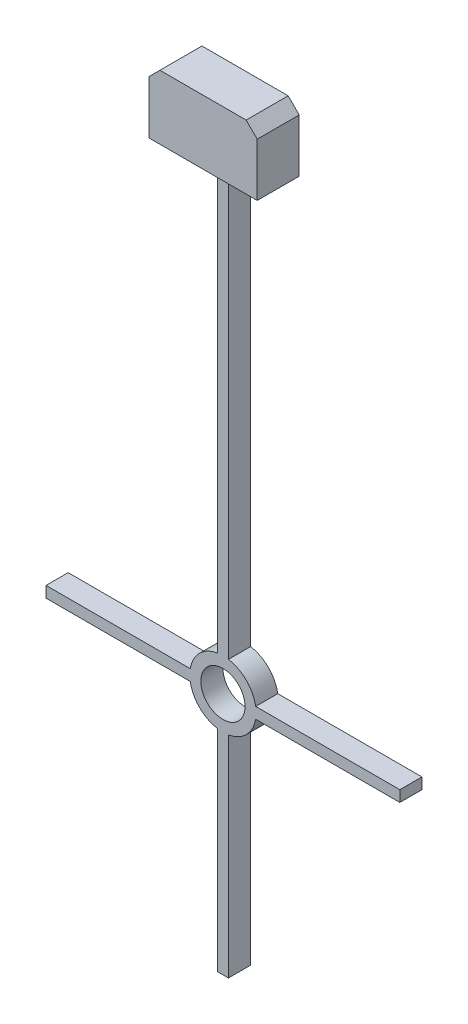
ISO-10303-21;
HEADER;
FILE_DESCRIPTION(('STEP AP214'),'2;1');
FILE_NAME('part.step','',(''),(''),'','','');
FILE_SCHEMA(('AUTOMOTIVE_DESIGN { 1 0 10303 214 1 1 1 1 }'));
ENDSEC;
DATA;
#1=APPLICATION_CONTEXT('core data for automotive mechanical design processes');
#2=APPLICATION_PROTOCOL_DEFINITION('international standard','automotive_design',2000,#1);
#3=PRODUCT_CONTEXT('',#1,'mechanical');
#4=PRODUCT('Part','Part','',(#3));
#5=PRODUCT_RELATED_PRODUCT_CATEGORY('part','',(#4));
#6=PRODUCT_DEFINITION_FORMATION('','',#4);
#7=PRODUCT_DEFINITION_CONTEXT('part definition',#1,'design');
#8=PRODUCT_DEFINITION('design','',#6,#7);
#9=PRODUCT_DEFINITION_SHAPE('','',#8);
#10=(LENGTH_UNIT() NAMED_UNIT(*) SI_UNIT(.MILLI.,.METRE.));
#11=(NAMED_UNIT(*) PLANE_ANGLE_UNIT() SI_UNIT($,.RADIAN.));
#12=(NAMED_UNIT(*) SI_UNIT($,.STERADIAN.) SOLID_ANGLE_UNIT());
#13=UNCERTAINTY_MEASURE_WITH_UNIT(LENGTH_MEASURE(1.E-05),#10,'distance_accuracy_value','');
#14=(GEOMETRIC_REPRESENTATION_CONTEXT(3) GLOBAL_UNCERTAINTY_ASSIGNED_CONTEXT((#13)) GLOBAL_UNIT_ASSIGNED_CONTEXT((#10,
#11,#12)) REPRESENTATION_CONTEXT('',''));
#15=CARTESIAN_POINT('',(0.,0.,0.));
#16=DIRECTION('',(0.,0.,1.));
#17=DIRECTION('',(1.,0.,0.));
#18=AXIS2_PLACEMENT_3D('',#15,#16,#17);
#19=CARTESIAN_POINT('',(0.,0.,0.5));
#20=DIRECTION('',(0.,0.,-1.));
#21=DIRECTION('',(-1.,0.,0.));
#22=AXIS2_PLACEMENT_3D('',#19,#20,#21);
#23=CYLINDRICAL_SURFACE('',#22,1.5);
#24=CARTESIAN_POINT('',(0.,0.,-0.5));
#25=DIRECTION('',(0.,0.,1.));
#26=DIRECTION('',(1.,0.,0.));
#27=AXIS2_PLACEMENT_3D('',#24,#25,#26);
#28=CIRCLE('',#27,1.5);
#29=CARTESIAN_POINT('',(-0.25,-1.4790199457749,-0.5));
#30=VERTEX_POINT('',#29);
#31=CARTESIAN_POINT('',(-1.4790199457749,-0.249999999999999,-0.5));
#32=VERTEX_POINT('',#31);
#33=EDGE_CURVE('E217',#30,#32,#28,.F.);
#34=ORIENTED_EDGE('',*,*,#33,.F.);
#35=DIRECTION('',(0.,0.,-1.));
#36=VECTOR('',#35,1.);
#37=CARTESIAN_POINT('',(-0.25,-1.4790199457749,0.5));
#38=LINE('',#37,#36);
#39=CARTESIAN_POINT('',(-0.25,-1.4790199457749,0.5));
#40=VERTEX_POINT('',#39);
#41=EDGE_CURVE('E278',#40,#30,#38,.T.);
#42=ORIENTED_EDGE('',*,*,#41,.F.);
#43=CARTESIAN_POINT('',(0.,0.,0.5));
#44=DIRECTION('',(0.,0.,1.));
#45=DIRECTION('',(1.,0.,0.));
#46=AXIS2_PLACEMENT_3D('',#43,#44,#45);
#47=CIRCLE('',#46,1.5);
#48=CARTESIAN_POINT('',(-1.4790199457749,-0.249999999999999,0.5));
#49=VERTEX_POINT('',#48);
#50=EDGE_CURVE('E251',#40,#49,#47,.F.);
#51=ORIENTED_EDGE('',*,*,#50,.T.);
#52=DIRECTION('',(0.,0.,-1.));
#53=VECTOR('',#52,1.);
#54=CARTESIAN_POINT('',(-1.4790199457749,-0.249999999999999,0.5));
#55=LINE('',#54,#53);
#56=EDGE_CURVE('E252',#49,#32,#55,.T.);
#57=ORIENTED_EDGE('',*,*,#56,.T.);
#58=EDGE_LOOP('',(#34,#42,#51,#57));
#59=FACE_BOUND('',#58,.T.);
#60=ADVANCED_FACE('F35',(#59),#23,.T.);
#61=CARTESIAN_POINT('',(-0.25,0.,0.5));
#62=DIRECTION('',(1.,0.,0.));
#63=DIRECTION('',(0.,1.,0.));
#64=AXIS2_PLACEMENT_3D('',#61,#62,#63);
#65=PLANE('',#64);
#66=DIRECTION('',(0.,-1.,0.));
#67=VECTOR('',#66,1.);
#68=CARTESIAN_POINT('',(-0.25,0.,-0.5));
#69=LINE('',#68,#67);
#70=CARTESIAN_POINT('',(-0.249999999999997,-11.,-0.5));
#71=VERTEX_POINT('',#70);
#72=EDGE_CURVE('E213',#30,#71,#69,.T.);
#73=ORIENTED_EDGE('',*,*,#72,.T.);
#74=DIRECTION('',(0.,0.,1.));
#75=VECTOR('',#74,1.);
#76=CARTESIAN_POINT('',(-0.249999999999997,-11.,0.5));
#77=LINE('',#76,#75);
#78=CARTESIAN_POINT('',(-0.249999999999997,-11.,0.5));
#79=VERTEX_POINT('',#78);
#80=EDGE_CURVE('E50',#71,#79,#77,.T.);
#81=ORIENTED_EDGE('',*,*,#80,.T.);
#82=DIRECTION('',(0.,-1.,0.));
#83=VECTOR('',#82,1.);
#84=CARTESIAN_POINT('',(-0.25,0.,0.5));
#85=LINE('',#84,#83);
#86=EDGE_CURVE('E365',#40,#79,#85,.T.);
#87=ORIENTED_EDGE('',*,*,#86,.F.);
#88=ORIENTED_EDGE('',*,*,#41,.T.);
#89=EDGE_LOOP('',(#73,#81,#87,#88));
#90=FACE_BOUND('',#89,.T.);
#91=ADVANCED_FACE('F439',(#90),#65,.F.);
#92=CARTESIAN_POINT('',(0.25,0.,0.5));
#93=DIRECTION('',(1.,0.,0.));
#94=DIRECTION('',(0.,1.,0.));
#95=AXIS2_PLACEMENT_3D('',#92,#93,#94);
#96=PLANE('',#95);
#97=DIRECTION('',(0.,0.,1.));
#98=VECTOR('',#97,1.);
#99=CARTESIAN_POINT('',(0.250000000000003,-11.,0.5));
#100=LINE('',#99,#98);
#101=CARTESIAN_POINT('',(0.250000000000003,-11.,-0.5));
#102=VERTEX_POINT('',#101);
#103=CARTESIAN_POINT('',(0.250000000000003,-11.,0.5));
#104=VERTEX_POINT('',#103);
#105=EDGE_CURVE('E194',#102,#104,#100,.T.);
#106=ORIENTED_EDGE('',*,*,#105,.F.);
#107=DIRECTION('',(0.,-1.,0.));
#108=VECTOR('',#107,1.);
#109=CARTESIAN_POINT('',(0.25,0.,-0.5));
#110=LINE('',#109,#108);
#111=CARTESIAN_POINT('',(0.25,-1.4790199457749,-0.5));
#112=VERTEX_POINT('',#111);
#113=EDGE_CURVE('E204',#112,#102,#110,.T.);
#114=ORIENTED_EDGE('',*,*,#113,.F.);
#115=DIRECTION('',(0.,0.,-1.));
#116=VECTOR('',#115,1.);
#117=CARTESIAN_POINT('',(0.25,-1.4790199457749,0.5));
#118=LINE('',#117,#116);
#119=CARTESIAN_POINT('',(0.25,-1.4790199457749,0.5));
#120=VERTEX_POINT('',#119);
#121=EDGE_CURVE('E276',#120,#112,#118,.T.);
#122=ORIENTED_EDGE('',*,*,#121,.F.);
#123=DIRECTION('',(0.,-1.,0.));
#124=VECTOR('',#123,1.);
#125=CARTESIAN_POINT('',(0.25,0.,0.5));
#126=LINE('',#125,#124);
#127=EDGE_CURVE('E206',#120,#104,#126,.T.);
#128=ORIENTED_EDGE('',*,*,#127,.T.);
#129=EDGE_LOOP('',(#106,#114,#122,#128));
#130=FACE_BOUND('',#129,.T.);
#131=ADVANCED_FACE('F203',(#130),#96,.T.);
#132=CARTESIAN_POINT('',(0.,0.,0.5));
#133=DIRECTION('',(0.,0.,-1.));
#134=DIRECTION('',(-1.,0.,0.));
#135=AXIS2_PLACEMENT_3D('',#132,#133,#134);
#136=CYLINDRICAL_SURFACE('',#135,1.5);
#137=CARTESIAN_POINT('',(0.,0.,-0.5));
#138=DIRECTION('',(0.,0.,1.));
#139=DIRECTION('',(1.,0.,0.));
#140=AXIS2_PLACEMENT_3D('',#137,#138,#139);
#141=CIRCLE('',#140,1.5);
#142=CARTESIAN_POINT('',(1.4790199457749,-0.249999999999999,-0.5));
#143=VERTEX_POINT('',#142);
#144=EDGE_CURVE('E212',#112,#143,#141,.T.);
#145=ORIENTED_EDGE('',*,*,#144,.T.);
#146=DIRECTION('',(0.,0.,-1.));
#147=VECTOR('',#146,1.);
#148=CARTESIAN_POINT('',(1.4790199457749,-0.249999999999999,0.5));
#149=LINE('',#148,#147);
#150=CARTESIAN_POINT('',(1.4790199457749,-0.249999999999999,0.5));
#151=VERTEX_POINT('',#150);
#152=EDGE_CURVE('E273',#151,#143,#149,.T.);
#153=ORIENTED_EDGE('',*,*,#152,.F.);
#154=CARTESIAN_POINT('',(0.,0.,0.5));
#155=DIRECTION('',(0.,0.,1.));
#156=DIRECTION('',(1.,0.,0.));
#157=AXIS2_PLACEMENT_3D('',#154,#155,#156);
#158=CIRCLE('',#157,1.5);
#159=EDGE_CURVE('E369',#120,#151,#158,.T.);
#160=ORIENTED_EDGE('',*,*,#159,.F.);
#161=ORIENTED_EDGE('',*,*,#121,.T.);
#162=EDGE_LOOP('',(#145,#153,#160,#161));
#163=FACE_BOUND('',#162,.T.);
#164=ADVANCED_FACE('F635',(#163),#136,.T.);
#165=CARTESIAN_POINT('',(0.,-0.249999999999999,0.5));
#166=DIRECTION('',(0.,1.,0.));
#167=DIRECTION('',(-1.,0.,0.));
#168=AXIS2_PLACEMENT_3D('',#165,#166,#167);
#169=PLANE('',#168);
#170=DIRECTION('',(1.,0.,0.));
#171=VECTOR('',#170,1.);
#172=CARTESIAN_POINT('',(0.,-0.249999999999999,-0.5));
#173=LINE('',#172,#171);
#174=CARTESIAN_POINT('',(8.,-0.25,-0.5));
#175=VERTEX_POINT('',#174);
#176=EDGE_CURVE('E215',#143,#175,#173,.T.);
#177=ORIENTED_EDGE('',*,*,#176,.T.);
#178=DIRECTION('',(0.,0.,-1.));
#179=VECTOR('',#178,1.);
#180=CARTESIAN_POINT('',(8.,-0.25,0.5));
#181=LINE('',#180,#179);
#182=CARTESIAN_POINT('',(8.,-0.25,0.5));
#183=VERTEX_POINT('',#182);
#184=EDGE_CURVE('E271',#183,#175,#181,.T.);
#185=ORIENTED_EDGE('',*,*,#184,.F.);
#186=DIRECTION('',(1.,0.,0.));
#187=VECTOR('',#186,1.);
#188=CARTESIAN_POINT('',(0.,-0.249999999999999,0.5));
#189=LINE('',#188,#187);
#190=EDGE_CURVE('E371',#151,#183,#189,.T.);
#191=ORIENTED_EDGE('',*,*,#190,.F.);
#192=ORIENTED_EDGE('',*,*,#152,.T.);
#193=EDGE_LOOP('',(#177,#185,#191,#192));
#194=FACE_BOUND('',#193,.T.);
#195=ADVANCED_FACE('F625',(#194),#169,.F.);
#196=CARTESIAN_POINT('',(8.,0.,0.5));
#197=DIRECTION('',(1.,0.,0.));
#198=DIRECTION('',(0.,0.,-1.));
#199=AXIS2_PLACEMENT_3D('',#196,#197,#198);
#200=PLANE('',#199);
#201=DIRECTION('',(0.,-1.,0.));
#202=VECTOR('',#201,1.);
#203=CARTESIAN_POINT('',(8.,0.,-0.5));
#204=LINE('',#203,#202);
#205=CARTESIAN_POINT('',(8.,0.25,-0.5));
#206=VERTEX_POINT('',#205);
#207=EDGE_CURVE('E223',#206,#175,#204,.T.);
#208=ORIENTED_EDGE('',*,*,#207,.F.);
#209=DIRECTION('',(0.,0.,-1.));
#210=VECTOR('',#209,1.);
#211=CARTESIAN_POINT('',(8.,0.25,0.5));
#212=LINE('',#211,#210);
#213=CARTESIAN_POINT('',(8.,0.25,0.5));
#214=VERTEX_POINT('',#213);
#215=EDGE_CURVE('E269',#214,#206,#212,.T.);
#216=ORIENTED_EDGE('',*,*,#215,.F.);
#217=DIRECTION('',(0.,-1.,0.));
#218=VECTOR('',#217,1.);
#219=CARTESIAN_POINT('',(8.,0.,0.5));
#220=LINE('',#219,#218);
#221=EDGE_CURVE('E373',#214,#183,#220,.T.);
#222=ORIENTED_EDGE('',*,*,#221,.T.);
#223=ORIENTED_EDGE('',*,*,#184,.T.);
#224=EDGE_LOOP('',(#208,#216,#222,#223));
#225=FACE_BOUND('',#224,.T.);
#226=ADVANCED_FACE('F615',(#225),#200,.T.);
#227=CARTESIAN_POINT('',(0.,0.25,0.5));
#228=DIRECTION('',(0.,1.,0.));
#229=DIRECTION('',(-1.,0.,0.));
#230=AXIS2_PLACEMENT_3D('',#227,#228,#229);
#231=PLANE('',#230);
#232=DIRECTION('',(1.,0.,0.));
#233=VECTOR('',#232,1.);
#234=CARTESIAN_POINT('',(0.,0.25,-0.5));
#235=LINE('',#234,#233);
#236=CARTESIAN_POINT('',(1.4790199457749,0.25,-0.5));
#237=VERTEX_POINT('',#236);
#238=EDGE_CURVE('E226',#237,#206,#235,.T.);
#239=ORIENTED_EDGE('',*,*,#238,.F.);
#240=DIRECTION('',(0.,0.,-1.));
#241=VECTOR('',#240,1.);
#242=CARTESIAN_POINT('',(1.4790199457749,0.25,0.5));
#243=LINE('',#242,#241);
#244=CARTESIAN_POINT('',(1.4790199457749,0.25,0.5));
#245=VERTEX_POINT('',#244);
#246=EDGE_CURVE('E267',#245,#237,#243,.T.);
#247=ORIENTED_EDGE('',*,*,#246,.F.);
#248=DIRECTION('',(1.,0.,0.));
#249=VECTOR('',#248,1.);
#250=CARTESIAN_POINT('',(0.,0.25,0.5));
#251=LINE('',#250,#249);
#252=EDGE_CURVE('E376',#245,#214,#251,.T.);
#253=ORIENTED_EDGE('',*,*,#252,.T.);
#254=ORIENTED_EDGE('',*,*,#215,.T.);
#255=EDGE_LOOP('',(#239,#247,#253,#254));
#256=FACE_BOUND('',#255,.T.);
#257=ADVANCED_FACE('F604',(#256),#231,.T.);
#258=CARTESIAN_POINT('',(0.,0.,0.5));
#259=DIRECTION('',(0.,0.,-1.));
#260=DIRECTION('',(-1.,0.,0.));
#261=AXIS2_PLACEMENT_3D('',#258,#259,#260);
#262=CYLINDRICAL_SURFACE('',#261,1.5);
#263=CARTESIAN_POINT('',(0.,0.,-0.5));
#264=DIRECTION('',(0.,0.,1.));
#265=DIRECTION('',(1.,0.,0.));
#266=AXIS2_PLACEMENT_3D('',#263,#264,#265);
#267=CIRCLE('',#266,1.5);
#268=CARTESIAN_POINT('',(0.25,1.4790199457749,-0.5));
#269=VERTEX_POINT('',#268);
#270=EDGE_CURVE('E229',#269,#237,#267,.F.);
#271=ORIENTED_EDGE('',*,*,#270,.F.);
#272=DIRECTION('',(0.,0.,-1.));
#273=VECTOR('',#272,1.);
#274=CARTESIAN_POINT('',(0.25,1.4790199457749,0.5));
#275=LINE('',#274,#273);
#276=CARTESIAN_POINT('',(0.25,1.4790199457749,0.5));
#277=VERTEX_POINT('',#276);
#278=EDGE_CURVE('E265',#277,#269,#275,.T.);
#279=ORIENTED_EDGE('',*,*,#278,.F.);
#280=CARTESIAN_POINT('',(0.,0.,0.5));
#281=DIRECTION('',(0.,0.,1.));
#282=DIRECTION('',(1.,0.,0.));
#283=AXIS2_PLACEMENT_3D('',#280,#281,#282);
#284=CIRCLE('',#283,1.5);
#285=EDGE_CURVE('E379',#277,#245,#284,.F.);
#286=ORIENTED_EDGE('',*,*,#285,.T.);
#287=ORIENTED_EDGE('',*,*,#246,.T.);
#288=EDGE_LOOP('',(#271,#279,#286,#287));
#289=FACE_BOUND('',#288,.T.);
#290=ADVANCED_FACE('F575',(#289),#262,.T.);
#291=CARTESIAN_POINT('',(0.25,0.,0.5));
#292=DIRECTION('',(-1.,0.,0.));
#293=DIRECTION('',(0.,-1.,0.));
#294=AXIS2_PLACEMENT_3D('',#291,#292,#293);
#295=PLANE('',#294);
#296=DIRECTION('',(0.,1.,0.));
#297=VECTOR('',#296,1.);
#298=CARTESIAN_POINT('',(0.25,0.,-0.5));
#299=LINE('',#298,#297);
#300=CARTESIAN_POINT('',(0.250000000000006,20.5,-0.5));
#301=VERTEX_POINT('',#300);
#302=EDGE_CURVE('E232',#269,#301,#299,.T.);
#303=ORIENTED_EDGE('',*,*,#302,.T.);
#304=DIRECTION('',(0.,0.,1.));
#305=VECTOR('',#304,1.);
#306=CARTESIAN_POINT('',(0.250000000000006,20.5,0.5));
#307=LINE('',#306,#305);
#308=CARTESIAN_POINT('',(0.250000000000006,20.5,0.5));
#309=VERTEX_POINT('',#308);
#310=EDGE_CURVE('E304',#301,#309,#307,.T.);
#311=ORIENTED_EDGE('',*,*,#310,.T.);
#312=DIRECTION('',(0.,1.,0.));
#313=VECTOR('',#312,1.);
#314=CARTESIAN_POINT('',(0.25,0.,0.5));
#315=LINE('',#314,#313);
#316=EDGE_CURVE('E342',#277,#309,#315,.T.);
#317=ORIENTED_EDGE('',*,*,#316,.F.);
#318=ORIENTED_EDGE('',*,*,#278,.T.);
#319=EDGE_LOOP('',(#303,#311,#317,#318));
#320=FACE_BOUND('',#319,.T.);
#321=ADVANCED_FACE('F465',(#320),#295,.F.);
#322=CARTESIAN_POINT('',(-0.25,0.,0.5));
#323=DIRECTION('',(-1.,0.,0.));
#324=DIRECTION('',(0.,-1.,0.));
#325=AXIS2_PLACEMENT_3D('',#322,#323,#324);
#326=PLANE('',#325);
#327=DIRECTION('',(0.,1.,0.));
#328=VECTOR('',#327,1.);
#329=CARTESIAN_POINT('',(-0.25,0.,0.5));
#330=LINE('',#329,#328);
#331=CARTESIAN_POINT('',(-0.25,1.4790199457749,0.5));
#332=VERTEX_POINT('',#331);
#333=CARTESIAN_POINT('',(-0.250000000000005,20.5,0.5));
#334=VERTEX_POINT('',#333);
#335=EDGE_CURVE('E335',#332,#334,#330,.T.);
#336=ORIENTED_EDGE('',*,*,#335,.T.);
#337=DIRECTION('',(0.,0.,-1.));
#338=VECTOR('',#337,1.);
#339=CARTESIAN_POINT('',(-0.250000000000005,20.5,0.5));
#340=LINE('',#339,#338);
#341=CARTESIAN_POINT('',(-0.250000000000005,20.5,-0.5));
#342=VERTEX_POINT('',#341);
#343=EDGE_CURVE('E306',#334,#342,#340,.T.);
#344=ORIENTED_EDGE('',*,*,#343,.T.);
#345=DIRECTION('',(0.,1.,0.));
#346=VECTOR('',#345,1.);
#347=CARTESIAN_POINT('',(-0.25,0.,-0.5));
#348=LINE('',#347,#346);
#349=CARTESIAN_POINT('',(-0.25,1.4790199457749,-0.5));
#350=VERTEX_POINT('',#349);
#351=EDGE_CURVE('E235',#350,#342,#348,.T.);
#352=ORIENTED_EDGE('',*,*,#351,.F.);
#353=DIRECTION('',(0.,0.,-1.));
#354=VECTOR('',#353,1.);
#355=CARTESIAN_POINT('',(-0.25,1.4790199457749,0.5));
#356=LINE('',#355,#354);
#357=EDGE_CURVE('E263',#332,#350,#356,.T.);
#358=ORIENTED_EDGE('',*,*,#357,.F.);
#359=EDGE_LOOP('',(#336,#344,#352,#358));
#360=FACE_BOUND('',#359,.T.);
#361=ADVANCED_FACE('F334',(#360),#326,.T.);
#362=CARTESIAN_POINT('',(0.,0.,0.5));
#363=DIRECTION('',(0.,0.,-1.));
#364=DIRECTION('',(-1.,0.,0.));
#365=AXIS2_PLACEMENT_3D('',#362,#363,#364);
#366=CYLINDRICAL_SURFACE('',#365,1.5);
#367=CARTESIAN_POINT('',(0.,0.,-0.5));
#368=DIRECTION('',(0.,0.,1.));
#369=DIRECTION('',(1.,0.,0.));
#370=AXIS2_PLACEMENT_3D('',#367,#368,#369);
#371=CIRCLE('',#370,1.5);
#372=CARTESIAN_POINT('',(-1.4790199457749,0.249999999999999,-0.5));
#373=VERTEX_POINT('',#372);
#374=EDGE_CURVE('E238',#350,#373,#371,.T.);
#375=ORIENTED_EDGE('',*,*,#374,.T.);
#376=DIRECTION('',(0.,0.,-1.));
#377=VECTOR('',#376,1.);
#378=CARTESIAN_POINT('',(-1.4790199457749,0.249999999999999,0.5));
#379=LINE('',#378,#377);
#380=CARTESIAN_POINT('',(-1.4790199457749,0.249999999999999,0.5));
#381=VERTEX_POINT('',#380);
#382=EDGE_CURVE('E260',#381,#373,#379,.T.);
#383=ORIENTED_EDGE('',*,*,#382,.F.);
#384=CARTESIAN_POINT('',(0.,0.,0.5));
#385=DIRECTION('',(0.,0.,1.));
#386=DIRECTION('',(1.,0.,0.));
#387=AXIS2_PLACEMENT_3D('',#384,#385,#386);
#388=CIRCLE('',#387,1.5);
#389=EDGE_CURVE('E337',#332,#381,#388,.T.);
#390=ORIENTED_EDGE('',*,*,#389,.F.);
#391=ORIENTED_EDGE('',*,*,#357,.T.);
#392=EDGE_LOOP('',(#375,#383,#390,#391));
#393=FACE_BOUND('',#392,.T.);
#394=ADVANCED_FACE('F457',(#393),#366,.T.);
#395=CARTESIAN_POINT('',(0.,0.249999999999999,0.5));
#396=DIRECTION('',(0.,-1.,0.));
#397=DIRECTION('',(1.,0.,0.));
#398=AXIS2_PLACEMENT_3D('',#395,#396,#397);
#399=PLANE('',#398);
#400=DIRECTION('',(-1.,0.,0.));
#401=VECTOR('',#400,1.);
#402=CARTESIAN_POINT('',(0.,0.249999999999999,-0.5));
#403=LINE('',#402,#401);
#404=CARTESIAN_POINT('',(-8.,0.25,-0.5));
#405=VERTEX_POINT('',#404);
#406=EDGE_CURVE('E240',#373,#405,#403,.T.);
#407=ORIENTED_EDGE('',*,*,#406,.T.);
#408=DIRECTION('',(0.,0.,-1.));
#409=VECTOR('',#408,1.);
#410=CARTESIAN_POINT('',(-8.,0.25,0.5));
#411=LINE('',#410,#409);
#412=CARTESIAN_POINT('',(-8.,0.25,0.5));
#413=VERTEX_POINT('',#412);
#414=EDGE_CURVE('E257',#413,#405,#411,.T.);
#415=ORIENTED_EDGE('',*,*,#414,.F.);
#416=DIRECTION('',(-1.,0.,0.));
#417=VECTOR('',#416,1.);
#418=CARTESIAN_POINT('',(0.,0.249999999999999,0.5));
#419=LINE('',#418,#417);
#420=EDGE_CURVE('E340',#381,#413,#419,.T.);
#421=ORIENTED_EDGE('',*,*,#420,.F.);
#422=ORIENTED_EDGE('',*,*,#382,.T.);
#423=EDGE_LOOP('',(#407,#415,#421,#422));
#424=FACE_BOUND('',#423,.T.);
#425=ADVANCED_FACE('F454',(#424),#399,.F.);
#426=CARTESIAN_POINT('',(-8.,0.,0.5));
#427=DIRECTION('',(1.,0.,0.));
#428=DIRECTION('',(0.,0.,-1.));
#429=AXIS2_PLACEMENT_3D('',#426,#427,#428);
#430=PLANE('',#429);
#431=DIRECTION('',(0.,-1.,0.));
#432=VECTOR('',#431,1.);
#433=CARTESIAN_POINT('',(-8.,0.,-0.5));
#434=LINE('',#433,#432);
#435=CARTESIAN_POINT('',(-8.,-0.25,-0.5));
#436=VERTEX_POINT('',#435);
#437=EDGE_CURVE('E242',#405,#436,#434,.T.);
#438=ORIENTED_EDGE('',*,*,#437,.T.);
#439=DIRECTION('',(0.,0.,-1.));
#440=VECTOR('',#439,1.);
#441=CARTESIAN_POINT('',(-8.,-0.25,0.5));
#442=LINE('',#441,#440);
#443=CARTESIAN_POINT('',(-8.,-0.25,0.5));
#444=VERTEX_POINT('',#443);
#445=EDGE_CURVE('E254',#444,#436,#442,.T.);
#446=ORIENTED_EDGE('',*,*,#445,.F.);
#447=DIRECTION('',(0.,-1.,0.));
#448=VECTOR('',#447,1.);
#449=CARTESIAN_POINT('',(-8.,0.,0.5));
#450=LINE('',#449,#448);
#451=EDGE_CURVE('E347',#413,#444,#450,.T.);
#452=ORIENTED_EDGE('',*,*,#451,.F.);
#453=ORIENTED_EDGE('',*,*,#414,.T.);
#454=EDGE_LOOP('',(#438,#446,#452,#453));
#455=FACE_BOUND('',#454,.T.);
#456=ADVANCED_FACE('F449',(#455),#430,.F.);
#457=CARTESIAN_POINT('',(0.,-0.249999999999999,0.5));
#458=DIRECTION('',(0.,-1.,0.));
#459=DIRECTION('',(1.,0.,0.));
#460=AXIS2_PLACEMENT_3D('',#457,#458,#459);
#461=PLANE('',#460);
#462=DIRECTION('',(-1.,0.,0.));
#463=VECTOR('',#462,1.);
#464=CARTESIAN_POINT('',(0.,-0.249999999999999,-0.5));
#465=LINE('',#464,#463);
#466=EDGE_CURVE('E245',#32,#436,#465,.T.);
#467=ORIENTED_EDGE('',*,*,#466,.F.);
#468=ORIENTED_EDGE('',*,*,#56,.F.);
#469=DIRECTION('',(-1.,0.,0.));
#470=VECTOR('',#469,1.);
#471=CARTESIAN_POINT('',(0.,-0.249999999999999,0.5));
#472=LINE('',#471,#470);
#473=EDGE_CURVE('E349',#49,#444,#472,.T.);
#474=ORIENTED_EDGE('',*,*,#473,.T.);
#475=ORIENTED_EDGE('',*,*,#445,.T.);
#476=EDGE_LOOP('',(#467,#468,#474,#475));
#477=FACE_BOUND('',#476,.T.);
#478=ADVANCED_FACE('F444',(#477),#461,.T.);
#479=CARTESIAN_POINT('',(0.,0.,0.5));
#480=DIRECTION('',(0.,0.,-1.));
#481=DIRECTION('',(-1.,0.,0.));
#482=AXIS2_PLACEMENT_3D('',#479,#480,#481);
#483=CYLINDRICAL_SURFACE('',#482,1.);
#484=CARTESIAN_POINT('',(0.,0.,0.5));
#485=DIRECTION('',(0.,0.,1.));
#486=DIRECTION('',(1.,0.,0.));
#487=AXIS2_PLACEMENT_3D('',#484,#485,#486);
#488=CIRCLE('',#487,1.);
#489=CARTESIAN_POINT('',(1.,0.,0.5));
#490=VERTEX_POINT('',#489);
#491=EDGE_CURVE('E255',#490,#490,#488,.T.);
#492=ORIENTED_EDGE('',*,*,#491,.T.);
#493=EDGE_LOOP('',(#492));
#494=FACE_BOUND('',#493,.T.);
#495=CARTESIAN_POINT('',(0.,0.,-0.5));
#496=DIRECTION('',(0.,0.,1.));
#497=DIRECTION('',(1.,0.,0.));
#498=AXIS2_PLACEMENT_3D('',#495,#496,#497);
#499=CIRCLE('',#498,1.);
#500=CARTESIAN_POINT('',(1.,0.,-0.5));
#501=VERTEX_POINT('',#500);
#502=EDGE_CURVE('E248',#501,#501,#499,.T.);
#503=ORIENTED_EDGE('',*,*,#502,.F.);
#504=EDGE_LOOP('',(#503));
#505=FACE_BOUND('',#504,.T.);
#506=ADVANCED_FACE('F502',(#494,#505),#483,.F.);
#507=CARTESIAN_POINT('',(0.,0.,0.5));
#508=DIRECTION('',(0.,0.,1.));
#509=DIRECTION('',(1.,0.,0.));
#510=AXIS2_PLACEMENT_3D('',#507,#508,#509);
#511=PLANE('',#510);
#512=DIRECTION('',(-1.,0.,0.));
#513=VECTOR('',#512,1.);
#514=CARTESIAN_POINT('',(0.,-11.,0.5));
#515=LINE('',#514,#513);
#516=EDGE_CURVE('E435',#104,#79,#515,.T.);
#517=ORIENTED_EDGE('',*,*,#516,.F.);
#518=ORIENTED_EDGE('',*,*,#127,.F.);
#519=ORIENTED_EDGE('',*,*,#159,.T.);
#520=ORIENTED_EDGE('',*,*,#190,.T.);
#521=ORIENTED_EDGE('',*,*,#221,.F.);
#522=ORIENTED_EDGE('',*,*,#252,.F.);
#523=ORIENTED_EDGE('',*,*,#285,.F.);
#524=ORIENTED_EDGE('',*,*,#316,.T.);
#525=DIRECTION('',(-0.707106781186547,-0.707106781186548,0.));
#526=VECTOR('',#525,1.);
#527=CARTESIAN_POINT('',(0.750000000000013,21.,0.5));
#528=LINE('',#527,#526);
#529=CARTESIAN_POINT('',(0.750000000000013,21.,0.5));
#530=VERTEX_POINT('',#529);
#531=EDGE_CURVE('E311',#309,#530,#528,.F.);
#532=ORIENTED_EDGE('',*,*,#531,.T.);
#533=DIRECTION('',(1.,0.,0.));
#534=VECTOR('',#533,1.);
#535=CARTESIAN_POINT('',(0.,21.,0.5));
#536=LINE('',#535,#534);
#537=CARTESIAN_POINT('',(-0.749999999999998,21.,0.5));
#538=VERTEX_POINT('',#537);
#539=EDGE_CURVE('E338',#538,#530,#536,.T.);
#540=ORIENTED_EDGE('',*,*,#539,.F.);
#541=DIRECTION('',(0.707106781186543,-0.707106781186552,0.));
#542=VECTOR('',#541,1.);
#543=CARTESIAN_POINT('',(-0.250000000000005,20.5,0.5));
#544=LINE('',#543,#542);
#545=EDGE_CURVE('E43',#538,#334,#544,.T.);
#546=ORIENTED_EDGE('',*,*,#545,.T.);
#547=ORIENTED_EDGE('',*,*,#335,.F.);
#548=ORIENTED_EDGE('',*,*,#389,.T.);
#549=ORIENTED_EDGE('',*,*,#420,.T.);
#550=ORIENTED_EDGE('',*,*,#451,.T.);
#551=ORIENTED_EDGE('',*,*,#473,.F.);
#552=ORIENTED_EDGE('',*,*,#50,.F.);
#553=ORIENTED_EDGE('',*,*,#86,.T.);
#554=EDGE_LOOP('',(#517,#518,#519,#520,#521,#522,#523,#524,#532,#540,#546,#547,#548,#549,#550,
#551,#552,#553));
#555=FACE_BOUND('',#554,.T.);
#556=ORIENTED_EDGE('',*,*,#491,.F.);
#557=EDGE_LOOP('',(#556));
#558=FACE_BOUND('',#557,.T.);
#559=ADVANCED_FACE('F385',(#555,#558),#511,.T.);
#560=CARTESIAN_POINT('',(0.,0.,-0.5));
#561=DIRECTION('',(0.,0.,1.));
#562=DIRECTION('',(1.,0.,0.));
#563=AXIS2_PLACEMENT_3D('',#560,#561,#562);
#564=PLANE('',#563);
#565=ORIENTED_EDGE('',*,*,#113,.T.);
#566=DIRECTION('',(-1.,0.,0.));
#567=VECTOR('',#566,1.);
#568=CARTESIAN_POINT('',(0.,-11.,-0.5));
#569=LINE('',#568,#567);
#570=EDGE_CURVE('E11',#102,#71,#569,.T.);
#571=ORIENTED_EDGE('',*,*,#570,.T.);
#572=ORIENTED_EDGE('',*,*,#72,.F.);
#573=ORIENTED_EDGE('',*,*,#33,.T.);
#574=ORIENTED_EDGE('',*,*,#466,.T.);
#575=ORIENTED_EDGE('',*,*,#437,.F.);
#576=ORIENTED_EDGE('',*,*,#406,.F.);
#577=ORIENTED_EDGE('',*,*,#374,.F.);
#578=ORIENTED_EDGE('',*,*,#351,.T.);
#579=DIRECTION('',(-0.707106781186543,0.707106781186552,0.));
#580=VECTOR('',#579,1.);
#581=CARTESIAN_POINT('',(10.125,10.1249999999999,-0.5));
#582=LINE('',#581,#580);
#583=CARTESIAN_POINT('',(-0.749999999999998,21.,-0.5));
#584=VERTEX_POINT('',#583);
#585=EDGE_CURVE('E314',#342,#584,#582,.T.);
#586=ORIENTED_EDGE('',*,*,#585,.T.);
#587=DIRECTION('',(-1.,0.,0.));
#588=VECTOR('',#587,1.);
#589=CARTESIAN_POINT('',(-2.45,21.,-0.5));
#590=LINE('',#589,#588);
#591=CARTESIAN_POINT('',(-2.45,21.,-0.5));
#592=VERTEX_POINT('',#591);
#593=EDGE_CURVE('E317',#584,#592,#590,.T.);
#594=ORIENTED_EDGE('',*,*,#593,.T.);
#595=DIRECTION('',(0.,1.,0.));
#596=VECTOR('',#595,1.);
#597=CARTESIAN_POINT('',(-2.45,23.9,-0.5));
#598=LINE('',#597,#596);
#599=CARTESIAN_POINT('',(-2.45,23.4,-0.5));
#600=VERTEX_POINT('',#599);
#601=EDGE_CURVE('E331',#592,#600,#598,.T.);
#602=ORIENTED_EDGE('',*,*,#601,.T.);
#603=DIRECTION('',(-0.707106781186548,-0.707106781186548,0.));
#604=VECTOR('',#603,1.);
#605=CARTESIAN_POINT('',(-2.45,23.4,-0.5));
#606=LINE('',#605,#604);
#607=CARTESIAN_POINT('',(-1.95000000000001,23.9,-0.5));
#608=VERTEX_POINT('',#607);
#609=EDGE_CURVE('E285',#600,#608,#606,.F.);
#610=ORIENTED_EDGE('',*,*,#609,.T.);
#611=DIRECTION('',(1.,0.,0.));
#612=VECTOR('',#611,1.);
#613=CARTESIAN_POINT('',(-2.45,23.9,-0.5));
#614=LINE('',#613,#612);
#615=CARTESIAN_POINT('',(1.95,23.9,-0.5));
#616=VERTEX_POINT('',#615);
#617=EDGE_CURVE('E399',#608,#616,#614,.T.);
#618=ORIENTED_EDGE('',*,*,#617,.T.);
#619=DIRECTION('',(-0.707106781186547,0.707106781186548,0.));
#620=VECTOR('',#619,1.);
#621=CARTESIAN_POINT('',(1.95,23.9,-0.5));
#622=LINE('',#621,#620);
#623=CARTESIAN_POINT('',(2.45,23.4,-0.5));
#624=VERTEX_POINT('',#623);
#625=EDGE_CURVE('E287',#616,#624,#622,.F.);
#626=ORIENTED_EDGE('',*,*,#625,.T.);
#627=DIRECTION('',(0.,-1.,0.));
#628=VECTOR('',#627,1.);
#629=CARTESIAN_POINT('',(2.45,23.9,-0.5));
#630=LINE('',#629,#628);
#631=CARTESIAN_POINT('',(2.45,21.,-0.5));
#632=VERTEX_POINT('',#631);
#633=EDGE_CURVE('E398',#624,#632,#630,.T.);
#634=ORIENTED_EDGE('',*,*,#633,.T.);
#635=CARTESIAN_POINT('',(0.750000000000013,21.,-0.5));
#636=VERTEX_POINT('',#635);
#637=EDGE_CURVE('E330',#632,#636,#590,.T.);
#638=ORIENTED_EDGE('',*,*,#637,.T.);
#639=DIRECTION('',(0.707106781186547,0.707106781186548,0.));
#640=VECTOR('',#639,1.);
#641=CARTESIAN_POINT('',(-10.125,10.125,-0.5));
#642=LINE('',#641,#640);
#643=EDGE_CURVE('E309',#636,#301,#642,.F.);
#644=ORIENTED_EDGE('',*,*,#643,.T.);
#645=ORIENTED_EDGE('',*,*,#302,.F.);
#646=ORIENTED_EDGE('',*,*,#270,.T.);
#647=ORIENTED_EDGE('',*,*,#238,.T.);
#648=ORIENTED_EDGE('',*,*,#207,.T.);
#649=ORIENTED_EDGE('',*,*,#176,.F.);
#650=ORIENTED_EDGE('',*,*,#144,.F.);
#651=EDGE_LOOP('',(#565,#571,#572,#573,#574,#575,#576,#577,#578,#586,#594,#602,#610,#618,#626,
#634,#638,#644,#645,#646,#647,#648,#649,#650));
#652=FACE_BOUND('',#651,.T.);
#653=ORIENTED_EDGE('',*,*,#502,.T.);
#654=EDGE_LOOP('',(#653));
#655=FACE_BOUND('',#654,.T.);
#656=ADVANCED_FACE('F209',(#652,#655),#564,.F.);
#657=CARTESIAN_POINT('',(2.45,23.9,1.4));
#658=DIRECTION('',(-1.,0.,0.));
#659=DIRECTION('',(0.,0.,1.));
#660=AXIS2_PLACEMENT_3D('',#657,#658,#659);
#661=PLANE('',#660);
#662=ORIENTED_EDGE('',*,*,#633,.F.);
#663=DIRECTION('',(0.,0.,1.));
#664=VECTOR('',#663,1.);
#665=CARTESIAN_POINT('',(2.45,23.4,1.4));
#666=LINE('',#665,#664);
#667=CARTESIAN_POINT('',(2.45,23.4,1.4));
#668=VERTEX_POINT('',#667);
#669=EDGE_CURVE('E289',#624,#668,#666,.T.);
#670=ORIENTED_EDGE('',*,*,#669,.T.);
#671=DIRECTION('',(0.,1.,0.));
#672=VECTOR('',#671,1.);
#673=CARTESIAN_POINT('',(2.45,23.9,1.4));
#674=LINE('',#673,#672);
#675=CARTESIAN_POINT('',(2.45,21.,1.4));
#676=VERTEX_POINT('',#675);
#677=EDGE_CURVE('E406',#676,#668,#674,.T.);
#678=ORIENTED_EDGE('',*,*,#677,.F.);
#679=DIRECTION('',(0.,0.,-1.));
#680=VECTOR('',#679,1.);
#681=CARTESIAN_POINT('',(2.45,21.,1.4));
#682=LINE('',#681,#680);
#683=EDGE_CURVE('E356',#676,#632,#682,.T.);
#684=ORIENTED_EDGE('',*,*,#683,.T.);
#685=EDGE_LOOP('',(#662,#670,#678,#684));
#686=FACE_BOUND('',#685,.T.);
#687=ADVANCED_FACE('F419',(#686),#661,.F.);
#688=CARTESIAN_POINT('',(-2.45,23.9,1.4));
#689=DIRECTION('',(0.,-1.,0.));
#690=DIRECTION('',(0.,0.,-1.));
#691=AXIS2_PLACEMENT_3D('',#688,#689,#690);
#692=PLANE('',#691);
#693=DIRECTION('',(-1.,0.,0.));
#694=VECTOR('',#693,1.);
#695=CARTESIAN_POINT('',(-2.45,23.9,1.4));
#696=LINE('',#695,#694);
#697=CARTESIAN_POINT('',(1.94999999999999,23.9,1.4));
#698=VERTEX_POINT('',#697);
#699=CARTESIAN_POINT('',(-1.95,23.9,1.4));
#700=VERTEX_POINT('',#699);
#701=EDGE_CURVE('E409',#698,#700,#696,.T.);
#702=ORIENTED_EDGE('',*,*,#701,.F.);
#703=DIRECTION('',(0.,0.,-1.));
#704=VECTOR('',#703,1.);
#705=CARTESIAN_POINT('',(1.95,23.9,1.4));
#706=LINE('',#705,#704);
#707=EDGE_CURVE('E282',#698,#616,#706,.T.);
#708=ORIENTED_EDGE('',*,*,#707,.T.);
#709=ORIENTED_EDGE('',*,*,#617,.F.);
#710=DIRECTION('',(0.,0.,1.));
#711=VECTOR('',#710,1.);
#712=CARTESIAN_POINT('',(-1.95000000000001,23.9,1.4));
#713=LINE('',#712,#711);
#714=EDGE_CURVE('E280',#608,#700,#713,.T.);
#715=ORIENTED_EDGE('',*,*,#714,.T.);
#716=EDGE_LOOP('',(#702,#708,#709,#715));
#717=FACE_BOUND('',#716,.T.);
#718=ADVANCED_FACE('F427',(#717),#692,.F.);
#719=CARTESIAN_POINT('',(-2.45,23.9,1.4));
#720=DIRECTION('',(1.,0.,0.));
#721=DIRECTION('',(0.,1.,0.));
#722=AXIS2_PLACEMENT_3D('',#719,#720,#721);
#723=PLANE('',#722);
#724=DIRECTION('',(0.,-1.,0.));
#725=VECTOR('',#724,1.);
#726=CARTESIAN_POINT('',(-2.45,23.9,1.4));
#727=LINE('',#726,#725);
#728=CARTESIAN_POINT('',(-2.45,23.4,1.4));
#729=VERTEX_POINT('',#728);
#730=CARTESIAN_POINT('',(-2.45,21.,1.4));
#731=VERTEX_POINT('',#730);
#732=EDGE_CURVE('E412',#729,#731,#727,.T.);
#733=ORIENTED_EDGE('',*,*,#732,.F.);
#734=DIRECTION('',(0.,0.,-1.));
#735=VECTOR('',#734,1.);
#736=CARTESIAN_POINT('',(-2.45,23.4,1.4));
#737=LINE('',#736,#735);
#738=EDGE_CURVE('E295',#729,#600,#737,.T.);
#739=ORIENTED_EDGE('',*,*,#738,.T.);
#740=ORIENTED_EDGE('',*,*,#601,.F.);
#741=DIRECTION('',(0.,0.,-1.));
#742=VECTOR('',#741,1.);
#743=CARTESIAN_POINT('',(-2.45,21.,1.4));
#744=LINE('',#743,#742);
#745=EDGE_CURVE('E328',#731,#592,#744,.T.);
#746=ORIENTED_EDGE('',*,*,#745,.F.);
#747=EDGE_LOOP('',(#733,#739,#740,#746));
#748=FACE_BOUND('',#747,.T.);
#749=ADVANCED_FACE('F434',(#748),#723,.F.);
#750=CARTESIAN_POINT('',(-2.45,21.,1.4));
#751=DIRECTION('',(0.,1.,0.));
#752=DIRECTION('',(0.,0.,1.));
#753=AXIS2_PLACEMENT_3D('',#750,#751,#752);
#754=PLANE('',#753);
#755=ORIENTED_EDGE('',*,*,#539,.T.);
#756=DIRECTION('',(0.,0.,-1.));
#757=VECTOR('',#756,1.);
#758=CARTESIAN_POINT('',(0.750000000000013,21.,-0.5));
#759=LINE('',#758,#757);
#760=EDGE_CURVE('E301',#530,#636,#759,.T.);
#761=ORIENTED_EDGE('',*,*,#760,.T.);
#762=ORIENTED_EDGE('',*,*,#637,.F.);
#763=ORIENTED_EDGE('',*,*,#683,.F.);
#764=DIRECTION('',(1.,0.,0.));
#765=VECTOR('',#764,1.);
#766=CARTESIAN_POINT('',(-2.45,21.,1.4));
#767=LINE('',#766,#765);
#768=EDGE_CURVE('E359',#731,#676,#767,.T.);
#769=ORIENTED_EDGE('',*,*,#768,.F.);
#770=ORIENTED_EDGE('',*,*,#745,.T.);
#771=ORIENTED_EDGE('',*,*,#593,.F.);
#772=DIRECTION('',(0.,0.,1.));
#773=VECTOR('',#772,1.);
#774=CARTESIAN_POINT('',(-0.749999999999998,21.,1.4));
#775=LINE('',#774,#773);
#776=EDGE_CURVE('E298',#584,#538,#775,.T.);
#777=ORIENTED_EDGE('',*,*,#776,.T.);
#778=EDGE_LOOP('',(#755,#761,#762,#763,#769,#770,#771,#777));
#779=FACE_BOUND('',#778,.T.);
#780=ADVANCED_FACE('F325',(#779),#754,.F.);
#781=CARTESIAN_POINT('',(0.,0.,1.4));
#782=DIRECTION('',(0.,0.,1.));
#783=DIRECTION('',(1.,0.,0.));
#784=AXIS2_PLACEMENT_3D('',#781,#782,#783);
#785=PLANE('',#784);
#786=ORIENTED_EDGE('',*,*,#677,.T.);
#787=DIRECTION('',(0.707106781186547,-0.707106781186548,0.));
#788=VECTOR('',#787,1.);
#789=CARTESIAN_POINT('',(12.925,12.925,1.4));
#790=LINE('',#789,#788);
#791=EDGE_CURVE('E293',#668,#698,#790,.F.);
#792=ORIENTED_EDGE('',*,*,#791,.T.);
#793=ORIENTED_EDGE('',*,*,#701,.T.);
#794=DIRECTION('',(0.707106781186548,0.707106781186548,0.));
#795=VECTOR('',#794,1.);
#796=CARTESIAN_POINT('',(-12.925,12.925,1.4));
#797=LINE('',#796,#795);
#798=EDGE_CURVE('E291',#700,#729,#797,.F.);
#799=ORIENTED_EDGE('',*,*,#798,.T.);
#800=ORIENTED_EDGE('',*,*,#732,.T.);
#801=ORIENTED_EDGE('',*,*,#768,.T.);
#802=EDGE_LOOP('',(#786,#792,#793,#799,#800,#801));
#803=FACE_BOUND('',#802,.T.);
#804=ADVANCED_FACE('F414',(#803),#785,.T.);
#805=CARTESIAN_POINT('',(1.95,23.9,1.4));
#806=DIRECTION('',(-0.707106781186548,-0.707106781186547,0.));
#807=DIRECTION('',(0.,0.,-1.));
#808=AXIS2_PLACEMENT_3D('',#805,#806,#807);
#809=PLANE('',#808);
#810=ORIENTED_EDGE('',*,*,#791,.F.);
#811=ORIENTED_EDGE('',*,*,#669,.F.);
#812=ORIENTED_EDGE('',*,*,#625,.F.);
#813=ORIENTED_EDGE('',*,*,#707,.F.);
#814=EDGE_LOOP('',(#810,#811,#812,#813));
#815=FACE_BOUND('',#814,.T.);
#816=ADVANCED_FACE('F422',(#815),#809,.F.);
#817=CARTESIAN_POINT('',(-2.45,23.4,1.4));
#818=DIRECTION('',(0.707106781186547,-0.707106781186547,0.));
#819=DIRECTION('',(0.,0.,-1.));
#820=AXIS2_PLACEMENT_3D('',#817,#818,#819);
#821=PLANE('',#820);
#822=ORIENTED_EDGE('',*,*,#798,.F.);
#823=ORIENTED_EDGE('',*,*,#714,.F.);
#824=ORIENTED_EDGE('',*,*,#609,.F.);
#825=ORIENTED_EDGE('',*,*,#738,.F.);
#826=EDGE_LOOP('',(#822,#823,#824,#825));
#827=FACE_BOUND('',#826,.T.);
#828=ADVANCED_FACE('F431',(#827),#821,.F.);
#829=CARTESIAN_POINT('',(0.750000000000013,21.,1.4));
#830=DIRECTION('',(0.707106781186548,-0.707106781186547,0.));
#831=DIRECTION('',(0.,0.,1.));
#832=AXIS2_PLACEMENT_3D('',#829,#830,#831);
#833=PLANE('',#832);
#834=ORIENTED_EDGE('',*,*,#531,.F.);
#835=ORIENTED_EDGE('',*,*,#310,.F.);
#836=ORIENTED_EDGE('',*,*,#643,.F.);
#837=ORIENTED_EDGE('',*,*,#760,.F.);
#838=EDGE_LOOP('',(#834,#835,#836,#837));
#839=FACE_BOUND('',#838,.T.);
#840=ADVANCED_FACE('F392',(#839),#833,.T.);
#841=CARTESIAN_POINT('',(-0.250000000000005,20.5,0.5));
#842=DIRECTION('',(0.707106781186552,0.707106781186543,0.));
#843=DIRECTION('',(0.,0.,-1.));
#844=AXIS2_PLACEMENT_3D('',#841,#842,#843);
#845=PLANE('',#844);
#846=ORIENTED_EDGE('',*,*,#545,.F.);
#847=ORIENTED_EDGE('',*,*,#776,.F.);
#848=ORIENTED_EDGE('',*,*,#585,.F.);
#849=ORIENTED_EDGE('',*,*,#343,.F.);
#850=EDGE_LOOP('',(#846,#847,#848,#849));
#851=FACE_BOUND('',#850,.T.);
#852=ADVANCED_FACE('F37',(#851),#845,.F.);
#853=CARTESIAN_POINT('',(-5.80959348682119,-11.,-5.));
#854=DIRECTION('',(0.,1.,0.));
#855=DIRECTION('',(0.,0.,1.));
#856=AXIS2_PLACEMENT_3D('',#853,#854,#855);
#857=PLANE('',#856);
#858=ORIENTED_EDGE('',*,*,#516,.T.);
#859=ORIENTED_EDGE('',*,*,#80,.F.);
#860=ORIENTED_EDGE('',*,*,#570,.F.);
#861=ORIENTED_EDGE('',*,*,#105,.T.);
#862=EDGE_LOOP('',(#858,#859,#860,#861));
#863=FACE_BOUND('',#862,.T.);
#864=ADVANCED_FACE('F193',(#863),#857,.F.);
#865=CLOSED_SHELL('',(#60,#91,#131,#164,#195,#226,#257,#290,#321,#361,#394,#425,#456,#478,#506,
#559,#656,#687,#718,#749,#780,#804,#816,#828,#840,#852,#864));
#866=MANIFOLD_SOLID_BREP('B2',#865);
#867=ADVANCED_BREP_SHAPE_REPRESENTATION('',(#18,#866),#14);
#868=SHAPE_DEFINITION_REPRESENTATION(#9,#867);
ENDSEC;
END-ISO-10303-21;
